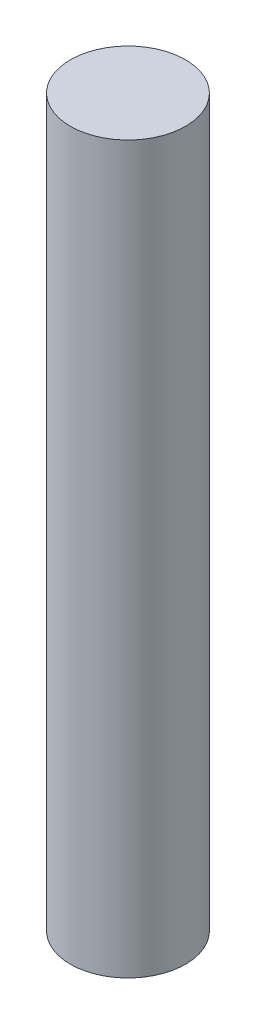
ISO-10303-21;
HEADER;
FILE_DESCRIPTION(('STEP AP214'),'2;1');
FILE_NAME('part.step','',(''),(''),'','','');
FILE_SCHEMA(('AUTOMOTIVE_DESIGN { 1 0 10303 214 1 1 1 1 }'));
ENDSEC;
DATA;
#1=APPLICATION_CONTEXT('core data for automotive mechanical design processes');
#2=APPLICATION_PROTOCOL_DEFINITION('international standard','automotive_design',2000,#1);
#3=PRODUCT_CONTEXT('',#1,'mechanical');
#4=PRODUCT('Part','Part','',(#3));
#5=PRODUCT_RELATED_PRODUCT_CATEGORY('part','',(#4));
#6=PRODUCT_DEFINITION_FORMATION('','',#4);
#7=PRODUCT_DEFINITION_CONTEXT('part definition',#1,'design');
#8=PRODUCT_DEFINITION('design','',#6,#7);
#9=PRODUCT_DEFINITION_SHAPE('','',#8);
#10=(LENGTH_UNIT() NAMED_UNIT(*) SI_UNIT(.MILLI.,.METRE.));
#11=(NAMED_UNIT(*) PLANE_ANGLE_UNIT() SI_UNIT($,.RADIAN.));
#12=(NAMED_UNIT(*) SI_UNIT($,.STERADIAN.) SOLID_ANGLE_UNIT());
#13=UNCERTAINTY_MEASURE_WITH_UNIT(LENGTH_MEASURE(1.E-05),#10,'distance_accuracy_value','');
#14=(GEOMETRIC_REPRESENTATION_CONTEXT(3) GLOBAL_UNCERTAINTY_ASSIGNED_CONTEXT((#13)) GLOBAL_UNIT_ASSIGNED_CONTEXT((#10,
#11,#12)) REPRESENTATION_CONTEXT('',''));
#15=CARTESIAN_POINT('',(0.,0.,0.));
#16=DIRECTION('',(0.,0.,1.));
#17=DIRECTION('',(1.,0.,0.));
#18=AXIS2_PLACEMENT_3D('',#15,#16,#17);
#19=CARTESIAN_POINT('',(0.,80.,0.));
#20=DIRECTION('',(0.,-1.,0.));
#21=DIRECTION('',(0.,0.,-1.));
#22=AXIS2_PLACEMENT_3D('',#19,#20,#21);
#23=CYLINDRICAL_SURFACE('',#22,6.35);
#24=CARTESIAN_POINT('',(0.,80.,0.));
#25=DIRECTION('',(0.,1.,0.));
#26=DIRECTION('',(0.,0.,1.));
#27=AXIS2_PLACEMENT_3D('',#24,#25,#26);
#28=CIRCLE('',#27,6.35);
#29=CARTESIAN_POINT('',(0.,80.,6.35));
#30=VERTEX_POINT('',#29);
#31=EDGE_CURVE('E10',#30,#30,#28,.T.);
#32=ORIENTED_EDGE('',*,*,#31,.F.);
#33=EDGE_LOOP('',(#32));
#34=FACE_BOUND('',#33,.T.);
#35=CARTESIAN_POINT('',(0.,0.,0.));
#36=DIRECTION('',(0.,1.,0.));
#37=DIRECTION('',(0.,0.,1.));
#38=AXIS2_PLACEMENT_3D('',#35,#36,#37);
#39=CIRCLE('',#38,6.35);
#40=CARTESIAN_POINT('',(0.,0.,6.35));
#41=VERTEX_POINT('',#40);
#42=EDGE_CURVE('E42',#41,#41,#39,.T.);
#43=ORIENTED_EDGE('',*,*,#42,.T.);
#44=EDGE_LOOP('',(#43));
#45=FACE_BOUND('',#44,.T.);
#46=ADVANCED_FACE('F39',(#34,#45),#23,.T.);
#47=CARTESIAN_POINT('',(0.,80.,0.));
#48=DIRECTION('',(0.,1.,0.));
#49=DIRECTION('',(0.,0.,1.));
#50=AXIS2_PLACEMENT_3D('',#47,#48,#49);
#51=PLANE('',#50);
#52=ORIENTED_EDGE('',*,*,#31,.T.);
#53=EDGE_LOOP('',(#52));
#54=FACE_BOUND('',#53,.T.);
#55=ADVANCED_FACE('F54',(#54),#51,.T.);
#56=CARTESIAN_POINT('',(0.,0.,0.));
#57=DIRECTION('',(0.,1.,0.));
#58=DIRECTION('',(0.,0.,1.));
#59=AXIS2_PLACEMENT_3D('',#56,#57,#58);
#60=PLANE('',#59);
#61=ORIENTED_EDGE('',*,*,#42,.F.);
#62=EDGE_LOOP('',(#61));
#63=FACE_BOUND('',#62,.T.);
#64=ADVANCED_FACE('F52',(#63),#60,.F.);
#65=CLOSED_SHELL('',(#46,#55,#64));
#66=MANIFOLD_SOLID_BREP('B2',#65);
#67=ADVANCED_BREP_SHAPE_REPRESENTATION('',(#18,#66),#14);
#68=SHAPE_DEFINITION_REPRESENTATION(#9,#67);
ENDSEC;
END-ISO-10303-21;
